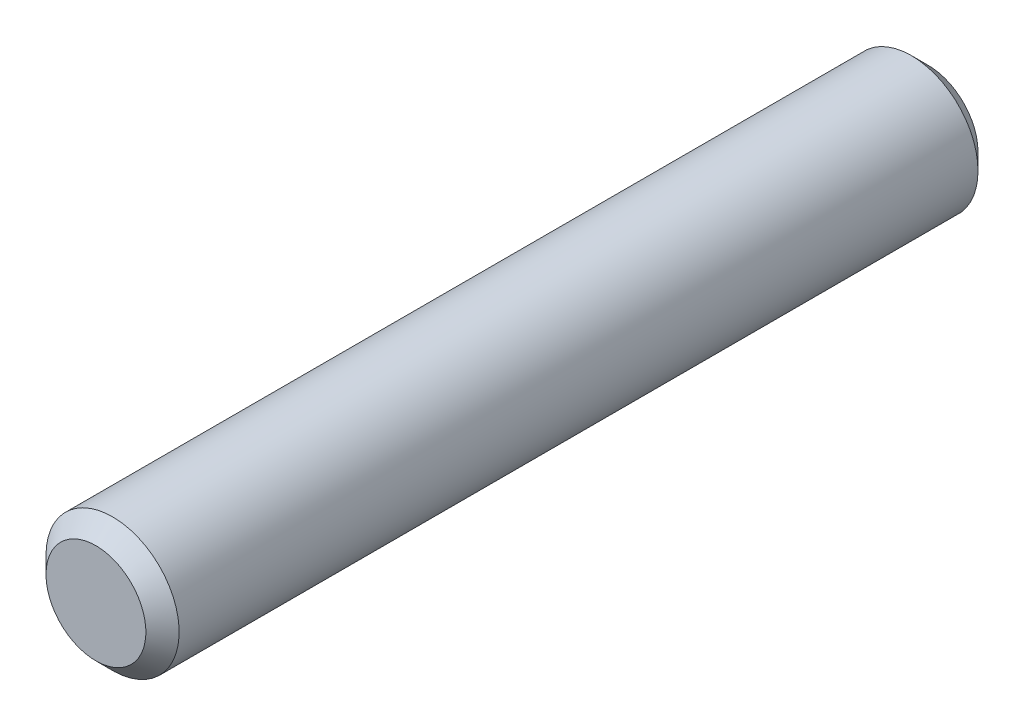
ISO-10303-21;
HEADER;
FILE_DESCRIPTION(('STEP AP214'),'2;1');
FILE_NAME('part.step','',(''),(''),'','','');
FILE_SCHEMA(('AUTOMOTIVE_DESIGN { 1 0 10303 214 1 1 1 1 }'));
ENDSEC;
DATA;
#1=APPLICATION_CONTEXT('core data for automotive mechanical design processes');
#2=APPLICATION_PROTOCOL_DEFINITION('international standard','automotive_design',2000,#1);
#3=PRODUCT_CONTEXT('',#1,'mechanical');
#4=PRODUCT('Part','Part','',(#3));
#5=PRODUCT_RELATED_PRODUCT_CATEGORY('part','',(#4));
#6=PRODUCT_DEFINITION_FORMATION('','',#4);
#7=PRODUCT_DEFINITION_CONTEXT('part definition',#1,'design');
#8=PRODUCT_DEFINITION('design','',#6,#7);
#9=PRODUCT_DEFINITION_SHAPE('','',#8);
#10=(LENGTH_UNIT() NAMED_UNIT(*) SI_UNIT(.MILLI.,.METRE.));
#11=(NAMED_UNIT(*) PLANE_ANGLE_UNIT() SI_UNIT($,.RADIAN.));
#12=(NAMED_UNIT(*) SI_UNIT($,.STERADIAN.) SOLID_ANGLE_UNIT());
#13=UNCERTAINTY_MEASURE_WITH_UNIT(LENGTH_MEASURE(1.E-05),#10,'distance_accuracy_value','');
#14=(GEOMETRIC_REPRESENTATION_CONTEXT(3) GLOBAL_UNCERTAINTY_ASSIGNED_CONTEXT((#13)) GLOBAL_UNIT_ASSIGNED_CONTEXT((#10,
#11,#12)) REPRESENTATION_CONTEXT('',''));
#15=CARTESIAN_POINT('',(0.,0.,0.));
#16=DIRECTION('',(0.,0.,1.));
#17=DIRECTION('',(1.,0.,0.));
#18=AXIS2_PLACEMENT_3D('',#15,#16,#17);
#19=CARTESIAN_POINT('',(3.05311331771918E-13,1.11022302462516E-13,49.9999999999992));
#20=DIRECTION('',(0.,0.,-0.999999999999975));
#21=DIRECTION('',(-1.00000000000001,0.,0.));
#22=AXIS2_PLACEMENT_3D('',#19,#20,#21);
#23=CYLINDRICAL_SURFACE('',#22,4.);
#24=CARTESIAN_POINT('',(1.22124532708767E-12,3.33066907387547E-13,1.0000000000005));
#25=DIRECTION('',(0.,0.,0.999999999999975));
#26=DIRECTION('',(1.00000000000001,0.,0.));
#27=AXIS2_PLACEMENT_3D('',#24,#25,#26);
#28=CIRCLE('',#27,4.);
#29=CARTESIAN_POINT('',(-3.99999999999984,1.27849120179491E-13,1.00000000000051));
#30=VERTEX_POINT('',#29);
#31=EDGE_CURVE('E55',#30,#30,#28,.T.);
#32=CARTESIAN_POINT('',(8.60422844084496E-13,7.7715611723761E-13,48.9999999999988));
#33=DIRECTION('',(0.,0.,0.999999999999975));
#34=DIRECTION('',(1.00000000000001,0.,0.));
#35=AXIS2_PLACEMENT_3D('',#32,#33,#34);
#36=CIRCLE('',#35,4.);
#37=CARTESIAN_POINT('',(-3.99999999999973,1.14526443883989E-13,48.9999999999988));
#38=VERTEX_POINT('',#37);
#39=EDGE_CURVE('E59',#38,#38,#36,.F.);
#40=CARTESIAN_POINT('',(-3.99999999999984,1.27849120179491E-13,1.00000000000051));
#41=CARTESIAN_POINT('',(-3.99999999999984,1.27710342301413E-13,1.50000000000049));
#42=CARTESIAN_POINT('',(-3.99999999999984,1.27571564423334E-13,2.00000000000047));
#43=CARTESIAN_POINT('',(-3.99999999999984,1.27294008667178E-13,3.00000000000043));
#44=CARTESIAN_POINT('',(-3.99999999999983,1.271552307891E-13,3.50000000000041));
#45=CARTESIAN_POINT('',(-3.99999999999983,1.26877675032944E-13,4.50000000000038));
#46=CARTESIAN_POINT('',(-3.99999999999983,1.26738897154866E-13,5.00000000000036));
#47=CARTESIAN_POINT('',(-3.99999999999983,1.26461341398709E-13,6.00000000000032));
#48=CARTESIAN_POINT('',(-3.99999999999983,1.26322563520631E-13,6.50000000000031));
#49=CARTESIAN_POINT('',(-3.99999999999983,1.26045007764475E-13,7.50000000000027));
#50=CARTESIAN_POINT('',(-3.99999999999982,1.25906229886397E-13,8.00000000000026));
#51=CARTESIAN_POINT('',(-3.99999999999982,1.2562867413024E-13,9.00000000000022));
#52=CARTESIAN_POINT('',(-3.99999999999982,1.25489896252162E-13,9.5000000000002));
#53=CARTESIAN_POINT('',(-3.99999999999982,1.25212340496006E-13,10.5000000000002));
#54=CARTESIAN_POINT('',(-3.99999999999982,1.25073562617928E-13,11.0000000000001));
#55=CARTESIAN_POINT('',(-3.99999999999982,1.24796006861772E-13,12.0000000000001));
#56=CARTESIAN_POINT('',(-3.99999999999981,1.24657228983693E-13,12.5000000000001));
#57=CARTESIAN_POINT('',(-3.99999999999981,1.24379673227537E-13,13.5000000000001));
#58=CARTESIAN_POINT('',(-3.99999999999981,1.24240895349459E-13,14.));
#59=CARTESIAN_POINT('',(-3.99999999999981,1.23963339593303E-13,15.));
#60=CARTESIAN_POINT('',(-3.99999999999981,1.23824561715225E-13,15.5));
#61=CARTESIAN_POINT('',(-3.99999999999981,1.23547005959068E-13,16.4999999999999));
#62=CARTESIAN_POINT('',(-3.9999999999998,1.2340822808099E-13,16.9999999999999));
#63=CARTESIAN_POINT('',(-3.9999999999998,1.23130672324834E-13,17.9999999999999));
#64=CARTESIAN_POINT('',(-3.9999999999998,1.22991894446756E-13,18.4999999999999));
#65=CARTESIAN_POINT('',(-3.9999999999998,1.22714338690599E-13,19.4999999999998));
#66=CARTESIAN_POINT('',(-3.9999999999998,1.22575560812521E-13,19.9999999999998));
#67=CARTESIAN_POINT('',(-3.99999999999979,1.22298005056365E-13,20.9999999999998));
#68=CARTESIAN_POINT('',(-3.99999999999979,1.22159227178287E-13,21.4999999999998));
#69=CARTESIAN_POINT('',(-3.99999999999979,1.21881671422131E-13,22.4999999999997));
#70=CARTESIAN_POINT('',(-3.99999999999979,1.21742893544052E-13,22.9999999999997));
#71=CARTESIAN_POINT('',(-3.99999999999979,1.21465337787896E-13,23.9999999999997));
#72=CARTESIAN_POINT('',(-3.99999999999979,1.21326559909818E-13,24.4999999999997));
#73=CARTESIAN_POINT('',(-3.99999999999979,1.21049004153662E-13,25.4999999999996));
#74=CARTESIAN_POINT('',(-3.99999999999978,1.20910226275584E-13,25.9999999999996));
#75=CARTESIAN_POINT('',(-3.99999999999978,1.20632670519427E-13,26.9999999999996));
#76=CARTESIAN_POINT('',(-3.99999999999978,1.20493892641349E-13,27.4999999999995));
#77=CARTESIAN_POINT('',(-3.99999999999978,1.20216336885193E-13,28.4999999999995));
#78=CARTESIAN_POINT('',(-3.99999999999978,1.20077559007115E-13,28.9999999999995));
#79=CARTESIAN_POINT('',(-3.99999999999977,1.19800003250958E-13,29.9999999999995));
#80=CARTESIAN_POINT('',(-3.99999999999977,1.1966122537288E-13,30.4999999999994));
#81=CARTESIAN_POINT('',(-3.99999999999977,1.19383669616724E-13,31.4999999999994));
#82=CARTESIAN_POINT('',(-3.99999999999977,1.19244891738646E-13,31.9999999999994));
#83=CARTESIAN_POINT('',(-3.99999999999977,1.1896733598249E-13,32.9999999999993));
#84=CARTESIAN_POINT('',(-3.99999999999977,1.18828558104411E-13,33.4999999999993));
#85=CARTESIAN_POINT('',(-3.99999999999976,1.18551002348255E-13,34.4999999999993));
#86=CARTESIAN_POINT('',(-3.99999999999976,1.18412224470177E-13,34.9999999999993));
#87=CARTESIAN_POINT('',(-3.99999999999976,1.18134668714021E-13,35.9999999999992));
#88=CARTESIAN_POINT('',(-3.99999999999976,1.17995890835943E-13,36.4999999999992));
#89=CARTESIAN_POINT('',(-3.99999999999976,1.17718335079786E-13,37.4999999999992));
#90=CARTESIAN_POINT('',(-3.99999999999976,1.17579557201708E-13,37.9999999999992));
#91=CARTESIAN_POINT('',(-3.99999999999975,1.17302001445552E-13,38.9999999999991));
#92=CARTESIAN_POINT('',(-3.99999999999975,1.17163223567474E-13,39.4999999999991));
#93=CARTESIAN_POINT('',(-3.99999999999975,1.16885667811317E-13,40.4999999999991));
#94=CARTESIAN_POINT('',(-3.99999999999975,1.16746889933239E-13,40.9999999999991));
#95=CARTESIAN_POINT('',(-3.99999999999975,1.16469334177083E-13,41.999999999999));
#96=CARTESIAN_POINT('',(-3.99999999999975,1.16330556299005E-13,42.499999999999));
#97=CARTESIAN_POINT('',(-3.99999999999974,1.16053000542848E-13,43.499999999999));
#98=CARTESIAN_POINT('',(-3.99999999999974,1.1591422266477E-13,43.9999999999989));
#99=CARTESIAN_POINT('',(-3.99999999999974,1.15636666908614E-13,44.9999999999989));
#100=CARTESIAN_POINT('',(-3.99999999999974,1.15497889030536E-13,45.4999999999989));
#101=CARTESIAN_POINT('',(-3.99999999999974,1.1522033327438E-13,46.4999999999989));
#102=CARTESIAN_POINT('',(-3.99999999999974,1.15081555396302E-13,46.9999999999988));
#103=CARTESIAN_POINT('',(-3.99999999999973,1.14803999640145E-13,47.9999999999988));
#104=CARTESIAN_POINT('',(-3.99999999999973,1.14665221762067E-13,48.4999999999988));
#105=CARTESIAN_POINT('',(-3.99999999999973,1.14526443883989E-13,48.9999999999988));
#106=B_SPLINE_CURVE_WITH_KNOTS('',3,(#40,#41,#42,#43,#44,#45,#46,#47,#48,#49,#50,#51,#52,#53,
#54,#55,#56,#57,#58,#59,#60,#61,#62,#63,#64,#65,#66,#67,#68,#69,#70,#71,#72,#73,#74,#75,#76,#77,
#78,#79,#80,#81,#82,#83,#84,#85,#86,#87,#88,#89,#90,#91,#92,#93,#94,#95,#96,#97,#98,#99,#100,
#101,#102,#103,#104,#105),.UNSPECIFIED.,.F.,.F.,(4,2,2,2,2,2,2,2,2,2,2,2,2,2,2,2,2,2,2,2,2,2,2,
2,2,2,2,2,2,2,2,2,4),(0.,1.49999999999994,2.99999999999989,4.49999999999983,5.99999999999978,
7.49999999999973,8.99999999999967,10.4999999999996,11.9999999999996,13.4999999999995,
14.9999999999995,16.4999999999994,17.9999999999993,19.4999999999993,20.9999999999992,
22.4999999999992,23.9999999999991,25.4999999999991,26.999999999999,28.499999999999,
29.9999999999989,31.4999999999989,32.9999999999988,34.4999999999988,35.9999999999987,
37.4999999999986,38.9999999999986,40.4999999999985,41.9999999999985,43.4999999999984,
44.9999999999984,46.4999999999983,47.9999999999983),.UNSPECIFIED.);
#107=EDGE_CURVE('BSEAM44',#30,#38,#106,.T.);
#108=ORIENTED_EDGE('',*,*,#31,.T.);
#109=ORIENTED_EDGE('',*,*,#39,.T.);
#110=ORIENTED_EDGE('',*,*,#107,.T.);
#111=ORIENTED_EDGE('',*,*,#107,.F.);
#112=EDGE_LOOP('',(#108,#110,#109,#111));
#113=FACE_BOUND('',#112,.T.);
#114=ADVANCED_FACE('F44',(#113),#23,.T.);
#115=CARTESIAN_POINT('',(3.05311331771918E-13,1.11022302462516E-13,49.9999999999992));
#116=DIRECTION('',(0.,0.,0.999999999999975));
#117=DIRECTION('',(1.00000000000001,0.,0.));
#118=AXIS2_PLACEMENT_3D('',#115,#116,#117);
#119=PLANE('',#118);
#120=CARTESIAN_POINT('',(3.05311331771918E-13,1.11022302462516E-13,49.9999999999992));
#121=DIRECTION('',(0.,0.,0.999999999999975));
#122=DIRECTION('',(1.00000000000001,0.,0.));
#123=AXIS2_PLACEMENT_3D('',#120,#121,#122);
#124=CIRCLE('',#123,2.99999999999999);
#125=CARTESIAN_POINT('',(-2.9999999999997,1.13442241711503E-13,49.9999999999992));
#126=VERTEX_POINT('',#125);
#127=EDGE_CURVE('E12',#126,#126,#124,.T.);
#128=ORIENTED_EDGE('',*,*,#127,.T.);
#129=EDGE_LOOP('',(#128));
#130=FACE_BOUND('',#129,.T.);
#131=ADVANCED_FACE('F75',(#130),#119,.T.);
#132=CARTESIAN_POINT('',(0.,0.,0.));
#133=DIRECTION('',(0.,0.,0.999999999999975));
#134=DIRECTION('',(1.00000000000001,0.,0.));
#135=AXIS2_PLACEMENT_3D('',#132,#133,#134);
#136=PLANE('',#135);
#137=CARTESIAN_POINT('',(0.,0.,0.));
#138=DIRECTION('',(0.,0.,0.999999999999975));
#139=DIRECTION('',(1.00000000000001,0.,0.));
#140=AXIS2_PLACEMENT_3D('',#137,#138,#139);
#141=CIRCLE('',#140,2.99999999999999);
#142=CARTESIAN_POINT('',(3.00000000000002,0.,0.));
#143=VERTEX_POINT('',#142);
#144=EDGE_CURVE('E51',#143,#143,#141,.F.);
#145=ORIENTED_EDGE('',*,*,#144,.T.);
#146=EDGE_LOOP('',(#145));
#147=FACE_BOUND('',#146,.T.);
#148=ADVANCED_FACE('F72',(#147),#136,.F.);
#149=CARTESIAN_POINT('',(1.22124532708767E-12,3.33066907387547E-13,1.0000000000005));
#150=DIRECTION('',(0.,0.,0.999999999999975));
#151=DIRECTION('',(1.00000000000001,0.,0.));
#152=AXIS2_PLACEMENT_3D('',#149,#150,#151);
#153=CONICAL_SURFACE('',#152,4.,0.785398163397452);
#154=ORIENTED_EDGE('',*,*,#144,.F.);
#155=EDGE_LOOP('',(#154));
#156=FACE_BOUND('',#155,.T.);
#157=ORIENTED_EDGE('',*,*,#31,.F.);
#158=EDGE_LOOP('',(#157));
#159=FACE_BOUND('',#158,.T.);
#160=ADVANCED_FACE('F68',(#156,#159),#153,.T.);
#161=CARTESIAN_POINT('',(3.05311331771918E-13,1.11022302462516E-13,49.9999999999992));
#162=DIRECTION('',(0.,0.,-0.999999999999975));
#163=DIRECTION('',(-1.00000000000001,0.,0.));
#164=AXIS2_PLACEMENT_3D('',#161,#162,#163);
#165=CONICAL_SURFACE('',#164,2.99999999999999,0.785398163397448);
#166=CARTESIAN_POINT('',(-4.00000000000018,1.14526443883989E-13,48.9999999999988));
#167=CARTESIAN_POINT('',(-3.98958333333351,1.14515150111359E-13,49.0104166666654));
#168=CARTESIAN_POINT('',(-3.97916666666684,1.14503856338729E-13,49.0208333333321));
#169=CARTESIAN_POINT('',(-3.9583333333335,1.14481268793469E-13,49.0416666666655));
#170=CARTESIAN_POINT('',(-3.94791666666682,1.14469975020839E-13,49.0520833333321));
#171=CARTESIAN_POINT('',(-3.92708333333348,1.14447387475579E-13,49.0729166666655));
#172=CARTESIAN_POINT('',(-3.91666666666681,1.14436093702949E-13,49.0833333333321));
#173=CARTESIAN_POINT('',(-3.89583333333346,1.14413506157689E-13,49.1041666666655));
#174=CARTESIAN_POINT('',(-3.88541666666679,1.14402212385059E-13,49.1145833333322));
#175=CARTESIAN_POINT('',(-3.86458333333345,1.14379624839798E-13,49.1354166666655));
#176=CARTESIAN_POINT('',(-3.85416666666678,1.14368331067168E-13,49.1458333333322));
#177=CARTESIAN_POINT('',(-3.83333333333343,1.14345743521908E-13,49.1666666666655));
#178=CARTESIAN_POINT('',(-3.82291666666676,1.14334449749278E-13,49.1770833333322));
#179=CARTESIAN_POINT('',(-3.80208333333342,1.14311862204018E-13,49.1979166666655));
#180=CARTESIAN_POINT('',(-3.79166666666675,1.14300568431388E-13,49.2083333333322));
#181=CARTESIAN_POINT('',(-3.7708333333334,1.14277980886128E-13,49.2291666666655));
#182=CARTESIAN_POINT('',(-3.76041666666673,1.14266687113498E-13,49.2395833333322));
#183=CARTESIAN_POINT('',(-3.73958333333339,1.14244099568238E-13,49.2604166666656));
#184=CARTESIAN_POINT('',(-3.72916666666672,1.14232805795608E-13,49.2708333333322));
#185=CARTESIAN_POINT('',(-3.70833333333337,1.14210218250348E-13,49.2916666666656));
#186=CARTESIAN_POINT('',(-3.6979166666667,1.14198924477717E-13,49.3020833333322));
#187=CARTESIAN_POINT('',(-3.67708333333336,1.14176336932457E-13,49.3229166666656));
#188=CARTESIAN_POINT('',(-3.66666666666669,1.14165043159827E-13,49.3333333333322));
#189=CARTESIAN_POINT('',(-3.64583333333334,1.14142455614567E-13,49.3541666666656));
#190=CARTESIAN_POINT('',(-3.63541666666667,1.14131161841937E-13,49.3645833333323));
#191=CARTESIAN_POINT('',(-3.61458333333333,1.14108574296677E-13,49.3854166666656));
#192=CARTESIAN_POINT('',(-3.60416666666666,1.14097280524047E-13,49.3958333333323));
#193=CARTESIAN_POINT('',(-3.58333333333331,1.14074692978787E-13,49.4166666666656));
#194=CARTESIAN_POINT('',(-3.57291666666664,1.14063399206157E-13,49.4270833333323));
#195=CARTESIAN_POINT('',(-3.5520833333333,1.14040811660897E-13,49.4479166666656));
#196=CARTESIAN_POINT('',(-3.54166666666663,1.14029517888267E-13,49.4583333333323));
#197=CARTESIAN_POINT('',(-3.52083333333328,1.14006930343006E-13,49.4791666666656));
#198=CARTESIAN_POINT('',(-3.51041666666661,1.13995636570376E-13,49.4895833333323));
#199=CARTESIAN_POINT('',(-3.48958333333327,1.13973049025116E-13,49.5104166666657));
#200=CARTESIAN_POINT('',(-3.4791666666666,1.13961755252486E-13,49.5208333333323));
#201=CARTESIAN_POINT('',(-3.45833333333325,1.13939167707226E-13,49.5416666666657));
#202=CARTESIAN_POINT('',(-3.44791666666658,1.13927873934596E-13,49.5520833333323));
#203=CARTESIAN_POINT('',(-3.42708333333324,1.13905286389336E-13,49.5729166666657));
#204=CARTESIAN_POINT('',(-3.41666666666657,1.13893992616706E-13,49.5833333333324));
#205=CARTESIAN_POINT('',(-3.39583333333322,1.13871405071446E-13,49.6041666666657));
#206=CARTESIAN_POINT('',(-3.38541666666655,1.13860111298816E-13,49.6145833333324));
#207=CARTESIAN_POINT('',(-3.36458333333321,1.13837523753555E-13,49.6354166666657));
#208=CARTESIAN_POINT('',(-3.35416666666654,1.13826229980925E-13,49.6458333333324));
#209=CARTESIAN_POINT('',(-3.3333333333332,1.13803642435665E-13,49.6666666666657));
#210=CARTESIAN_POINT('',(-3.32291666666652,1.13792348663035E-13,49.6770833333324));
#211=CARTESIAN_POINT('',(-3.30208333333318,1.13769761117775E-13,49.6979166666658));
#212=CARTESIAN_POINT('',(-3.29166666666651,1.13758467345145E-13,49.7083333333324));
#213=CARTESIAN_POINT('',(-3.27083333333316,1.13735879799885E-13,49.7291666666658));
#214=CARTESIAN_POINT('',(-3.26041666666649,1.13724586027255E-13,49.7395833333324));
#215=CARTESIAN_POINT('',(-3.23958333333315,1.13701998481995E-13,49.7604166666658));
#216=CARTESIAN_POINT('',(-3.22916666666648,1.13690704709365E-13,49.7708333333324));
#217=CARTESIAN_POINT('',(-3.20833333333313,1.13668117164105E-13,49.7916666666658));
#218=CARTESIAN_POINT('',(-3.19791666666646,1.13656823391474E-13,49.8020833333325));
#219=CARTESIAN_POINT('',(-3.17708333333312,1.13634235846214E-13,49.8229166666658));
#220=CARTESIAN_POINT('',(-3.16666666666645,1.13622942073584E-13,49.8333333333325));
#221=CARTESIAN_POINT('',(-3.1458333333331,1.13600354528324E-13,49.8541666666658));
#222=CARTESIAN_POINT('',(-3.13541666666643,1.13589060755694E-13,49.8645833333325));
#223=CARTESIAN_POINT('',(-3.11458333333309,1.13566473210434E-13,49.8854166666658));
#224=CARTESIAN_POINT('',(-3.10416666666642,1.13555179437804E-13,49.8958333333325));
#225=CARTESIAN_POINT('',(-3.08333333333307,1.13532591892544E-13,49.9166666666658));
#226=CARTESIAN_POINT('',(-3.0729166666664,1.13521298119914E-13,49.9270833333325));
#227=CARTESIAN_POINT('',(-3.05208333333306,1.13498710574654E-13,49.9479166666659));
#228=CARTESIAN_POINT('',(-3.04166666666639,1.13487416802024E-13,49.9583333333325));
#229=CARTESIAN_POINT('',(-3.02083333333304,1.13464829256763E-13,49.9791666666659));
#230=CARTESIAN_POINT('',(-3.01041666666637,1.13453535484133E-13,49.9895833333325));
#231=CARTESIAN_POINT('',(-2.9999999999997,1.13442241711503E-13,49.9999999999992));
#232=B_SPLINE_CURVE_WITH_KNOTS('',3,(#166,#167,#168,#169,#170,#171,#172,#173,#174,#175,#176,
#177,#178,#179,#180,#181,#182,#183,#184,#185,#186,#187,#188,#189,#190,#191,#192,#193,#194,#195,
#196,#197,#198,#199,#200,#201,#202,#203,#204,#205,#206,#207,#208,#209,#210,#211,#212,#213,#214,
#215,#216,#217,#218,#219,#220,#221,#222,#223,#224,#225,#226,#227,#228,#229,#230,#231),
.UNSPECIFIED.,.F.,.F.,(4,2,2,2,2,2,2,2,2,2,2,2,2,2,2,2,2,2,2,2,2,2,2,2,2,2,2,2,2,2,2,2,4),(0.,
0.0441941738241764,0.0883883476483596,0.132582521472537,0.176776695296719,0.220970869120896,
0.265165042945078,0.309359216769256,0.353553390593437,0.397747564417615,0.441941738241797,
0.486135912065974,0.530330085890156,0.574524259714333,0.618718433538515,0.662912607362693,
0.707106781186875,0.751300955011052,0.795495128835234,0.839689302659412,0.883883476483588,
0.928077650307771,0.972271824131953,1.01646599795613,1.06066017178031,1.10485434560449,
1.14904851942867,1.19324269325285,1.23743686707703,1.28163104090121,1.32582521472539,
1.37001938854957,1.41421356237374),.UNSPECIFIED.);
#233=EDGE_CURVE('BSEAM46',#38,#126,#232,.T.);
#234=ORIENTED_EDGE('',*,*,#39,.F.);
#235=ORIENTED_EDGE('',*,*,#127,.F.);
#236=ORIENTED_EDGE('',*,*,#233,.T.);
#237=ORIENTED_EDGE('',*,*,#233,.F.);
#238=EDGE_LOOP('',(#234,#236,#235,#237));
#239=FACE_BOUND('',#238,.T.);
#240=ADVANCED_FACE('F46',(#239),#165,.T.);
#241=CLOSED_SHELL('',(#114,#131,#148,#160,#240));
#242=MANIFOLD_SOLID_BREP('B2',#241);
#243=ADVANCED_BREP_SHAPE_REPRESENTATION('',(#18,#242),#14);
#244=SHAPE_DEFINITION_REPRESENTATION(#9,#243);
ENDSEC;
END-ISO-10303-21;
